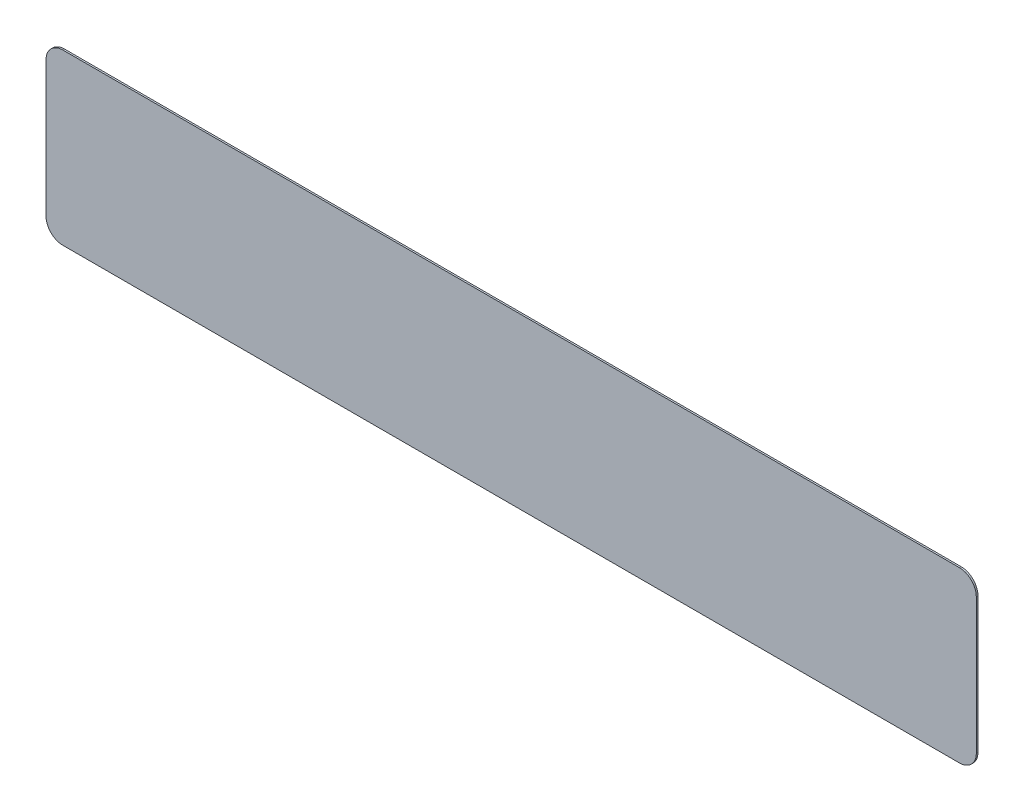
ISO-10303-21;
HEADER;
FILE_DESCRIPTION(('STEP AP214'),'2;1');
FILE_NAME('part.step','',(''),(''),'','','');
FILE_SCHEMA(('AUTOMOTIVE_DESIGN { 1 0 10303 214 1 1 1 1 }'));
ENDSEC;
DATA;
#1=APPLICATION_CONTEXT('core data for automotive mechanical design processes');
#2=APPLICATION_PROTOCOL_DEFINITION('international standard','automotive_design',2000,#1);
#3=PRODUCT_CONTEXT('',#1,'mechanical');
#4=PRODUCT('Part','Part','',(#3));
#5=PRODUCT_RELATED_PRODUCT_CATEGORY('part','',(#4));
#6=PRODUCT_DEFINITION_FORMATION('','',#4);
#7=PRODUCT_DEFINITION_CONTEXT('part definition',#1,'design');
#8=PRODUCT_DEFINITION('design','',#6,#7);
#9=PRODUCT_DEFINITION_SHAPE('','',#8);
#10=(LENGTH_UNIT() NAMED_UNIT(*) SI_UNIT(.MILLI.,.METRE.));
#11=(NAMED_UNIT(*) PLANE_ANGLE_UNIT() SI_UNIT($,.RADIAN.));
#12=(NAMED_UNIT(*) SI_UNIT($,.STERADIAN.) SOLID_ANGLE_UNIT());
#13=UNCERTAINTY_MEASURE_WITH_UNIT(LENGTH_MEASURE(1.E-05),#10,'distance_accuracy_value','');
#14=(GEOMETRIC_REPRESENTATION_CONTEXT(3) GLOBAL_UNCERTAINTY_ASSIGNED_CONTEXT((#13)) GLOBAL_UNIT_ASSIGNED_CONTEXT((#10,
#11,#12)) REPRESENTATION_CONTEXT('',''));
#15=CARTESIAN_POINT('',(0.,0.,0.));
#16=DIRECTION('',(0.,0.,1.));
#17=DIRECTION('',(1.,0.,0.));
#18=AXIS2_PLACEMENT_3D('',#15,#16,#17);
#19=CARTESIAN_POINT('',(53.,-8.,0.2));
#20=DIRECTION('',(0.,0.,-1.));
#21=DIRECTION('',(-1.,0.,0.));
#22=AXIS2_PLACEMENT_3D('',#19,#20,#21);
#23=CYLINDRICAL_SURFACE('',#22,2.);
#24=CARTESIAN_POINT('',(53.,-8.,0.));
#25=DIRECTION('',(0.,0.,1.));
#26=DIRECTION('',(1.,0.,0.));
#27=AXIS2_PLACEMENT_3D('',#24,#25,#26);
#28=CIRCLE('',#27,2.);
#29=CARTESIAN_POINT('',(53.,-10.,0.));
#30=VERTEX_POINT('',#29);
#31=CARTESIAN_POINT('',(55.,-7.99999999999998,0.));
#32=VERTEX_POINT('',#31);
#33=EDGE_CURVE('E130',#30,#32,#28,.T.);
#34=ORIENTED_EDGE('',*,*,#33,.T.);
#35=DIRECTION('',(0.,0.,-1.));
#36=VECTOR('',#35,1.);
#37=CARTESIAN_POINT('',(55.,-7.99999999999998,0.2));
#38=LINE('',#37,#36);
#39=CARTESIAN_POINT('',(55.,-7.99999999999998,0.2));
#40=VERTEX_POINT('',#39);
#41=EDGE_CURVE('E11',#40,#32,#38,.T.);
#42=ORIENTED_EDGE('',*,*,#41,.F.);
#43=CARTESIAN_POINT('',(53.,-8.,0.2));
#44=DIRECTION('',(0.,0.,1.));
#45=DIRECTION('',(1.,0.,0.));
#46=AXIS2_PLACEMENT_3D('',#43,#44,#45);
#47=CIRCLE('',#46,2.);
#48=CARTESIAN_POINT('',(53.,-10.,0.2));
#49=VERTEX_POINT('',#48);
#50=EDGE_CURVE('E144',#49,#40,#47,.T.);
#51=ORIENTED_EDGE('',*,*,#50,.F.);
#52=DIRECTION('',(0.,0.,-1.));
#53=VECTOR('',#52,1.);
#54=CARTESIAN_POINT('',(53.,-10.,0.2));
#55=LINE('',#54,#53);
#56=EDGE_CURVE('E126',#49,#30,#55,.T.);
#57=ORIENTED_EDGE('',*,*,#56,.T.);
#58=EDGE_LOOP('',(#34,#42,#51,#57));
#59=FACE_BOUND('',#58,.T.);
#60=ADVANCED_FACE('F34',(#59),#23,.T.);
#61=CARTESIAN_POINT('',(55.,-7.99999999999998,0.2));
#62=DIRECTION('',(-1.,0.,0.));
#63=DIRECTION('',(0.,0.,1.));
#64=AXIS2_PLACEMENT_3D('',#61,#62,#63);
#65=PLANE('',#64);
#66=DIRECTION('',(0.,1.,0.));
#67=VECTOR('',#66,1.);
#68=CARTESIAN_POINT('',(55.,-7.99999999999998,0.));
#69=LINE('',#68,#67);
#70=CARTESIAN_POINT('',(55.,7.99999999999999,0.));
#71=VERTEX_POINT('',#70);
#72=EDGE_CURVE('E133',#32,#71,#69,.T.);
#73=ORIENTED_EDGE('',*,*,#72,.T.);
#74=DIRECTION('',(0.,0.,-1.));
#75=VECTOR('',#74,1.);
#76=CARTESIAN_POINT('',(55.,7.99999999999999,0.2));
#77=LINE('',#76,#75);
#78=CARTESIAN_POINT('',(55.,7.99999999999999,0.2));
#79=VERTEX_POINT('',#78);
#80=EDGE_CURVE('E42',#79,#71,#77,.T.);
#81=ORIENTED_EDGE('',*,*,#80,.F.);
#82=DIRECTION('',(0.,1.,0.));
#83=VECTOR('',#82,1.);
#84=CARTESIAN_POINT('',(55.,-7.99999999999998,0.2));
#85=LINE('',#84,#83);
#86=EDGE_CURVE('E93',#40,#79,#85,.T.);
#87=ORIENTED_EDGE('',*,*,#86,.F.);
#88=ORIENTED_EDGE('',*,*,#41,.T.);
#89=EDGE_LOOP('',(#73,#81,#87,#88));
#90=FACE_BOUND('',#89,.T.);
#91=ADVANCED_FACE('F179',(#90),#65,.F.);
#92=CARTESIAN_POINT('',(53.,8.,0.2));
#93=DIRECTION('',(0.,0.,-1.));
#94=DIRECTION('',(-1.,0.,0.));
#95=AXIS2_PLACEMENT_3D('',#92,#93,#94);
#96=CYLINDRICAL_SURFACE('',#95,2.);
#97=CARTESIAN_POINT('',(53.,8.,0.));
#98=DIRECTION('',(0.,0.,1.));
#99=DIRECTION('',(-1.,0.,0.));
#100=AXIS2_PLACEMENT_3D('',#97,#98,#99);
#101=CIRCLE('',#100,2.);
#102=CARTESIAN_POINT('',(53.,10.,0.));
#103=VERTEX_POINT('',#102);
#104=EDGE_CURVE('E135',#71,#103,#101,.T.);
#105=ORIENTED_EDGE('',*,*,#104,.T.);
#106=DIRECTION('',(0.,0.,-1.));
#107=VECTOR('',#106,1.);
#108=CARTESIAN_POINT('',(53.,10.,0.2));
#109=LINE('',#108,#107);
#110=CARTESIAN_POINT('',(53.,10.,0.2));
#111=VERTEX_POINT('',#110);
#112=EDGE_CURVE('E151',#111,#103,#109,.T.);
#113=ORIENTED_EDGE('',*,*,#112,.F.);
#114=CARTESIAN_POINT('',(53.,8.,0.2));
#115=DIRECTION('',(0.,0.,1.));
#116=DIRECTION('',(-1.,0.,0.));
#117=AXIS2_PLACEMENT_3D('',#114,#115,#116);
#118=CIRCLE('',#117,2.);
#119=EDGE_CURVE('E159',#79,#111,#118,.T.);
#120=ORIENTED_EDGE('',*,*,#119,.F.);
#121=ORIENTED_EDGE('',*,*,#80,.T.);
#122=EDGE_LOOP('',(#105,#113,#120,#121));
#123=FACE_BOUND('',#122,.T.);
#124=ADVANCED_FACE('F157',(#123),#96,.T.);
#125=CARTESIAN_POINT('',(-53.,10.,0.2));
#126=DIRECTION('',(0.,-1.,0.));
#127=DIRECTION('',(0.,0.,-1.));
#128=AXIS2_PLACEMENT_3D('',#125,#126,#127);
#129=PLANE('',#128);
#130=DIRECTION('',(-1.,0.,0.));
#131=VECTOR('',#130,1.);
#132=CARTESIAN_POINT('',(-53.,10.,0.));
#133=LINE('',#132,#131);
#134=CARTESIAN_POINT('',(-53.,10.,0.));
#135=VERTEX_POINT('',#134);
#136=EDGE_CURVE('E137',#103,#135,#133,.T.);
#137=ORIENTED_EDGE('',*,*,#136,.T.);
#138=DIRECTION('',(0.,0.,-1.));
#139=VECTOR('',#138,1.);
#140=CARTESIAN_POINT('',(-53.,10.,0.2));
#141=LINE('',#140,#139);
#142=CARTESIAN_POINT('',(-53.,10.,0.2));
#143=VERTEX_POINT('',#142);
#144=EDGE_CURVE('E148',#143,#135,#141,.T.);
#145=ORIENTED_EDGE('',*,*,#144,.F.);
#146=DIRECTION('',(-1.,0.,0.));
#147=VECTOR('',#146,1.);
#148=CARTESIAN_POINT('',(-53.,10.,0.2));
#149=LINE('',#148,#147);
#150=EDGE_CURVE('E171',#111,#143,#149,.T.);
#151=ORIENTED_EDGE('',*,*,#150,.F.);
#152=ORIENTED_EDGE('',*,*,#112,.T.);
#153=EDGE_LOOP('',(#137,#145,#151,#152));
#154=FACE_BOUND('',#153,.T.);
#155=ADVANCED_FACE('F167',(#154),#129,.F.);
#156=CARTESIAN_POINT('',(-53.,8.,0.2));
#157=DIRECTION('',(0.,0.,-1.));
#158=DIRECTION('',(-1.,0.,0.));
#159=AXIS2_PLACEMENT_3D('',#156,#157,#158);
#160=CYLINDRICAL_SURFACE('',#159,2.);
#161=CARTESIAN_POINT('',(-53.,8.,0.));
#162=DIRECTION('',(0.,0.,1.));
#163=DIRECTION('',(-1.,0.,0.));
#164=AXIS2_PLACEMENT_3D('',#161,#162,#163);
#165=CIRCLE('',#164,2.);
#166=CARTESIAN_POINT('',(-55.,7.99999999999999,0.));
#167=VERTEX_POINT('',#166);
#168=EDGE_CURVE('E139',#135,#167,#165,.T.);
#169=ORIENTED_EDGE('',*,*,#168,.T.);
#170=DIRECTION('',(0.,0.,-1.));
#171=VECTOR('',#170,1.);
#172=CARTESIAN_POINT('',(-55.,7.99999999999999,0.2));
#173=LINE('',#172,#171);
#174=CARTESIAN_POINT('',(-55.,7.99999999999999,0.2));
#175=VERTEX_POINT('',#174);
#176=EDGE_CURVE('E121',#175,#167,#173,.T.);
#177=ORIENTED_EDGE('',*,*,#176,.F.);
#178=CARTESIAN_POINT('',(-53.,8.,0.2));
#179=DIRECTION('',(0.,0.,1.));
#180=DIRECTION('',(-1.,0.,0.));
#181=AXIS2_PLACEMENT_3D('',#178,#179,#180);
#182=CIRCLE('',#181,2.);
#183=EDGE_CURVE('E112',#143,#175,#182,.T.);
#184=ORIENTED_EDGE('',*,*,#183,.F.);
#185=ORIENTED_EDGE('',*,*,#144,.T.);
#186=EDGE_LOOP('',(#169,#177,#184,#185));
#187=FACE_BOUND('',#186,.T.);
#188=ADVANCED_FACE('F170',(#187),#160,.T.);
#189=CARTESIAN_POINT('',(-55.,-7.99999999999998,0.2));
#190=DIRECTION('',(1.,0.,0.));
#191=DIRECTION('',(0.,0.,-1.));
#192=AXIS2_PLACEMENT_3D('',#189,#190,#191);
#193=PLANE('',#192);
#194=DIRECTION('',(0.,-1.,0.));
#195=VECTOR('',#194,1.);
#196=CARTESIAN_POINT('',(-55.,-7.99999999999998,0.));
#197=LINE('',#196,#195);
#198=CARTESIAN_POINT('',(-55.,-7.99999999999998,0.));
#199=VERTEX_POINT('',#198);
#200=EDGE_CURVE('E120',#167,#199,#197,.T.);
#201=ORIENTED_EDGE('',*,*,#200,.T.);
#202=DIRECTION('',(0.,0.,-1.));
#203=VECTOR('',#202,1.);
#204=CARTESIAN_POINT('',(-55.,-7.99999999999998,0.2));
#205=LINE('',#204,#203);
#206=CARTESIAN_POINT('',(-55.,-7.99999999999998,0.2));
#207=VERTEX_POINT('',#206);
#208=EDGE_CURVE('E117',#207,#199,#205,.T.);
#209=ORIENTED_EDGE('',*,*,#208,.F.);
#210=DIRECTION('',(0.,-1.,0.));
#211=VECTOR('',#210,1.);
#212=CARTESIAN_POINT('',(-55.,-7.99999999999998,0.2));
#213=LINE('',#212,#211);
#214=EDGE_CURVE('E106',#175,#207,#213,.T.);
#215=ORIENTED_EDGE('',*,*,#214,.F.);
#216=ORIENTED_EDGE('',*,*,#176,.T.);
#217=EDGE_LOOP('',(#201,#209,#215,#216));
#218=FACE_BOUND('',#217,.T.);
#219=ADVANCED_FACE('F118',(#218),#193,.F.);
#220=CARTESIAN_POINT('',(-53.,-8.,0.2));
#221=DIRECTION('',(0.,0.,-1.));
#222=DIRECTION('',(-1.,0.,0.));
#223=AXIS2_PLACEMENT_3D('',#220,#221,#222);
#224=CYLINDRICAL_SURFACE('',#223,2.);
#225=CARTESIAN_POINT('',(-53.,-8.,0.));
#226=DIRECTION('',(0.,0.,1.));
#227=DIRECTION('',(-1.,0.,0.));
#228=AXIS2_PLACEMENT_3D('',#225,#226,#227);
#229=CIRCLE('',#228,2.);
#230=CARTESIAN_POINT('',(-53.,-10.,0.));
#231=VERTEX_POINT('',#230);
#232=EDGE_CURVE('E79',#199,#231,#229,.T.);
#233=ORIENTED_EDGE('',*,*,#232,.T.);
#234=DIRECTION('',(0.,0.,-1.));
#235=VECTOR('',#234,1.);
#236=CARTESIAN_POINT('',(-53.,-10.,0.2));
#237=LINE('',#236,#235);
#238=CARTESIAN_POINT('',(-53.,-10.,0.2));
#239=VERTEX_POINT('',#238);
#240=EDGE_CURVE('E122',#239,#231,#237,.T.);
#241=ORIENTED_EDGE('',*,*,#240,.F.);
#242=CARTESIAN_POINT('',(-53.,-8.,0.2));
#243=DIRECTION('',(0.,0.,1.));
#244=DIRECTION('',(-1.,0.,0.));
#245=AXIS2_PLACEMENT_3D('',#242,#243,#244);
#246=CIRCLE('',#245,2.);
#247=EDGE_CURVE('E110',#207,#239,#246,.T.);
#248=ORIENTED_EDGE('',*,*,#247,.F.);
#249=ORIENTED_EDGE('',*,*,#208,.T.);
#250=EDGE_LOOP('',(#233,#241,#248,#249));
#251=FACE_BOUND('',#250,.T.);
#252=ADVANCED_FACE('F124',(#251),#224,.T.);
#253=CARTESIAN_POINT('',(-53.,-10.,0.2));
#254=DIRECTION('',(0.,1.,0.));
#255=DIRECTION('',(0.,0.,1.));
#256=AXIS2_PLACEMENT_3D('',#253,#254,#255);
#257=PLANE('',#256);
#258=DIRECTION('',(1.,0.,0.));
#259=VECTOR('',#258,1.);
#260=CARTESIAN_POINT('',(-53.,-10.,0.));
#261=LINE('',#260,#259);
#262=EDGE_CURVE('E85',#231,#30,#261,.T.);
#263=ORIENTED_EDGE('',*,*,#262,.T.);
#264=ORIENTED_EDGE('',*,*,#56,.F.);
#265=DIRECTION('',(1.,0.,0.));
#266=VECTOR('',#265,1.);
#267=CARTESIAN_POINT('',(-53.,-10.,0.2));
#268=LINE('',#267,#266);
#269=EDGE_CURVE('E50',#239,#49,#268,.T.);
#270=ORIENTED_EDGE('',*,*,#269,.F.);
#271=ORIENTED_EDGE('',*,*,#240,.T.);
#272=EDGE_LOOP('',(#263,#264,#270,#271));
#273=FACE_BOUND('',#272,.T.);
#274=ADVANCED_FACE('F195',(#273),#257,.F.);
#275=CARTESIAN_POINT('',(53.,-8.,0.2));
#276=DIRECTION('',(0.,0.,1.));
#277=DIRECTION('',(1.,0.,0.));
#278=AXIS2_PLACEMENT_3D('',#275,#276,#277);
#279=PLANE('',#278);
#280=ORIENTED_EDGE('',*,*,#50,.T.);
#281=ORIENTED_EDGE('',*,*,#86,.T.);
#282=ORIENTED_EDGE('',*,*,#119,.T.);
#283=ORIENTED_EDGE('',*,*,#150,.T.);
#284=ORIENTED_EDGE('',*,*,#183,.T.);
#285=ORIENTED_EDGE('',*,*,#214,.T.);
#286=ORIENTED_EDGE('',*,*,#247,.T.);
#287=ORIENTED_EDGE('',*,*,#269,.T.);
#288=EDGE_LOOP('',(#280,#281,#282,#283,#284,#285,#286,#287));
#289=FACE_BOUND('',#288,.T.);
#290=ADVANCED_FACE('F108',(#289),#279,.T.);
#291=CARTESIAN_POINT('',(53.,-8.,0.));
#292=DIRECTION('',(0.,0.,1.));
#293=DIRECTION('',(1.,0.,0.));
#294=AXIS2_PLACEMENT_3D('',#291,#292,#293);
#295=PLANE('',#294);
#296=ORIENTED_EDGE('',*,*,#33,.F.);
#297=ORIENTED_EDGE('',*,*,#262,.F.);
#298=ORIENTED_EDGE('',*,*,#232,.F.);
#299=ORIENTED_EDGE('',*,*,#200,.F.);
#300=ORIENTED_EDGE('',*,*,#168,.F.);
#301=ORIENTED_EDGE('',*,*,#136,.F.);
#302=ORIENTED_EDGE('',*,*,#104,.F.);
#303=ORIENTED_EDGE('',*,*,#72,.F.);
#304=EDGE_LOOP('',(#296,#297,#298,#299,#300,#301,#302,#303));
#305=FACE_BOUND('',#304,.T.);
#306=ADVANCED_FACE('F163',(#305),#295,.F.);
#307=CLOSED_SHELL('',(#60,#91,#124,#155,#188,#219,#252,#274,#290,#306));
#308=MANIFOLD_SOLID_BREP('B2',#307);
#309=ADVANCED_BREP_SHAPE_REPRESENTATION('',(#18,#308),#14);
#310=SHAPE_DEFINITION_REPRESENTATION(#9,#309);
ENDSEC;
END-ISO-10303-21;
